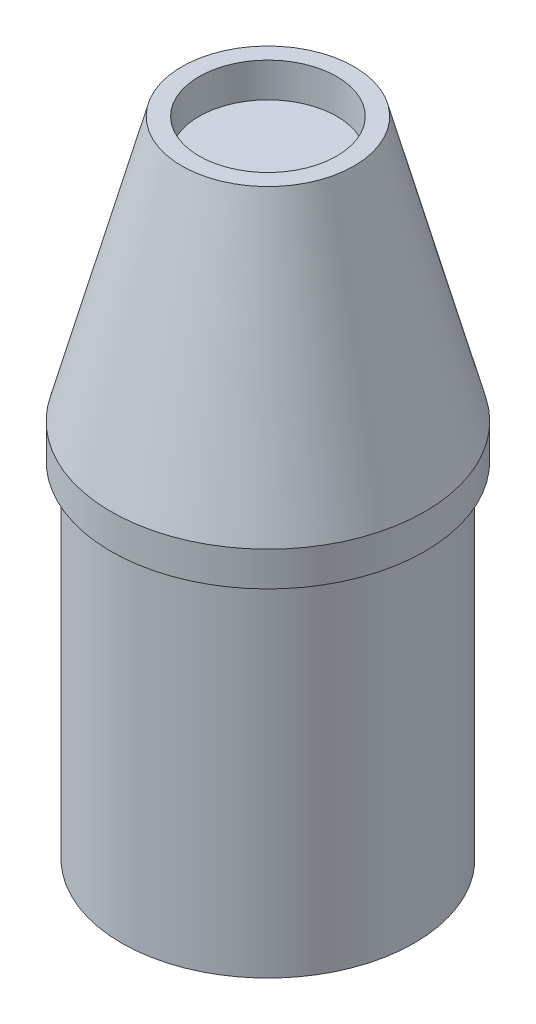
ISO-10303-21;
HEADER;
FILE_DESCRIPTION(('STEP AP214'),'2;1');
FILE_NAME('part.step','',(''),(''),'','','');
FILE_SCHEMA(('AUTOMOTIVE_DESIGN { 1 0 10303 214 1 1 1 1 }'));
ENDSEC;
DATA;
#1=APPLICATION_CONTEXT('core data for automotive mechanical design processes');
#2=APPLICATION_PROTOCOL_DEFINITION('international standard','automotive_design',2000,#1);
#3=PRODUCT_CONTEXT('',#1,'mechanical');
#4=PRODUCT('Part','Part','',(#3));
#5=PRODUCT_RELATED_PRODUCT_CATEGORY('part','',(#4));
#6=PRODUCT_DEFINITION_FORMATION('','',#4);
#7=PRODUCT_DEFINITION_CONTEXT('part definition',#1,'design');
#8=PRODUCT_DEFINITION('design','',#6,#7);
#9=PRODUCT_DEFINITION_SHAPE('','',#8);
#10=(LENGTH_UNIT() NAMED_UNIT(*) SI_UNIT(.MILLI.,.METRE.));
#11=(NAMED_UNIT(*) PLANE_ANGLE_UNIT() SI_UNIT($,.RADIAN.));
#12=(NAMED_UNIT(*) SI_UNIT($,.STERADIAN.) SOLID_ANGLE_UNIT());
#13=UNCERTAINTY_MEASURE_WITH_UNIT(LENGTH_MEASURE(1.E-05),#10,'distance_accuracy_value','');
#14=(GEOMETRIC_REPRESENTATION_CONTEXT(3) GLOBAL_UNCERTAINTY_ASSIGNED_CONTEXT((#13)) GLOBAL_UNIT_ASSIGNED_CONTEXT((#10,
#11,#12)) REPRESENTATION_CONTEXT('',''));
#15=CARTESIAN_POINT('',(0.,0.,0.));
#16=DIRECTION('',(0.,0.,1.));
#17=DIRECTION('',(1.,0.,0.));
#18=AXIS2_PLACEMENT_3D('',#15,#16,#17);
#19=CARTESIAN_POINT('',(26.9875,-4.24972556290004,0.));
#20=DIRECTION('',(0.,-1.,0.));
#21=DIRECTION('',(1.,0.,0.));
#22=AXIS2_PLACEMENT_3D('',#19,#20,#21);
#23=PLANE('',#22);
#24=CARTESIAN_POINT('',(0.,-4.24972556290004,0.));
#25=DIRECTION('',(0.,-1.,0.));
#26=DIRECTION('',(1.,0.,0.));
#27=AXIS2_PLACEMENT_3D('',#24,#25,#26);
#28=CIRCLE('',#27,26.9875);
#29=CARTESIAN_POINT('',(26.9875,-4.24972556290004,0.));
#30=VERTEX_POINT('',#29);
#31=EDGE_CURVE('E62',#30,#30,#28,.T.);
#32=ORIENTED_EDGE('',*,*,#31,.T.);
#33=EDGE_LOOP('',(#32));
#34=FACE_BOUND('',#33,.T.);
#35=ADVANCED_FACE('F37',(#34),#23,.T.);
#36=CARTESIAN_POINT('',(0.,107.927039915141,0.));
#37=DIRECTION('',(0.,1.,0.));
#38=DIRECTION('',(-1.,0.,0.));
#39=AXIS2_PLACEMENT_3D('',#36,#37,#38);
#40=PLANE('',#39);
#41=CARTESIAN_POINT('',(0.,107.927039915141,0.));
#42=DIRECTION('',(0.,-1.,0.));
#43=DIRECTION('',(1.,0.,0.));
#44=AXIS2_PLACEMENT_3D('',#41,#42,#43);
#45=CIRCLE('',#44,12.7);
#46=CARTESIAN_POINT('',(12.7,107.927039915141,0.));
#47=VERTEX_POINT('',#46);
#48=EDGE_CURVE('E10',#47,#47,#45,.T.);
#49=ORIENTED_EDGE('',*,*,#48,.F.);
#50=EDGE_LOOP('',(#49));
#51=FACE_BOUND('',#50,.T.);
#52=ADVANCED_FACE('F79',(#51),#40,.T.);
#53=CARTESIAN_POINT('',(0.,-4.24972556290004,0.));
#54=DIRECTION('',(0.,-1.,0.));
#55=DIRECTION('',(1.,0.,0.));
#56=AXIS2_PLACEMENT_3D('',#53,#54,#55);
#57=CYLINDRICAL_SURFACE('',#56,12.7);
#58=ORIENTED_EDGE('',*,*,#48,.T.);
#59=EDGE_LOOP('',(#58));
#60=FACE_BOUND('',#59,.T.);
#61=CARTESIAN_POINT('',(0.,114.277039915141,0.));
#62=DIRECTION('',(0.,-1.,0.));
#63=DIRECTION('',(1.,0.,0.));
#64=AXIS2_PLACEMENT_3D('',#61,#62,#63);
#65=CIRCLE('',#64,12.7);
#66=CARTESIAN_POINT('',(12.7,114.277039915141,0.));
#67=VERTEX_POINT('',#66);
#68=EDGE_CURVE('E43',#67,#67,#65,.T.);
#69=ORIENTED_EDGE('',*,*,#68,.F.);
#70=EDGE_LOOP('',(#69));
#71=FACE_BOUND('',#70,.T.);
#72=ADVANCED_FACE('F83',(#60,#71),#57,.F.);
#73=CARTESIAN_POINT('',(12.7,114.277039915141,0.));
#74=DIRECTION('',(0.,1.,0.));
#75=DIRECTION('',(-1.,0.,0.));
#76=AXIS2_PLACEMENT_3D('',#73,#74,#75);
#77=PLANE('',#76);
#78=ORIENTED_EDGE('',*,*,#68,.T.);
#79=EDGE_LOOP('',(#78));
#80=FACE_BOUND('',#79,.T.);
#81=CARTESIAN_POINT('',(0.,114.277039915141,0.));
#82=DIRECTION('',(0.,-1.,0.));
#83=DIRECTION('',(1.,0.,0.));
#84=AXIS2_PLACEMENT_3D('',#81,#82,#83);
#85=CIRCLE('',#84,15.875);
#86=CARTESIAN_POINT('',(15.875,114.277039915141,0.));
#87=VERTEX_POINT('',#86);
#88=EDGE_CURVE('E47',#87,#87,#85,.T.);
#89=ORIENTED_EDGE('',*,*,#88,.F.);
#90=EDGE_LOOP('',(#89));
#91=FACE_BOUND('',#90,.T.);
#92=ADVANCED_FACE('F88',(#80,#91),#77,.T.);
#93=CARTESIAN_POINT('',(0.,65.6002744371,0.));
#94=DIRECTION('',(0.,-1.,0.));
#95=DIRECTION('',(1.,0.,0.));
#96=AXIS2_PLACEMENT_3D('',#93,#94,#95);
#97=CONICAL_SURFACE('',#96,28.9179,0.261799387799143);
#98=ORIENTED_EDGE('',*,*,#88,.T.);
#99=EDGE_LOOP('',(#98));
#100=FACE_BOUND('',#99,.T.);
#101=CARTESIAN_POINT('',(0.,65.6002744371,0.));
#102=DIRECTION('',(0.,-1.,0.));
#103=DIRECTION('',(1.,0.,0.));
#104=AXIS2_PLACEMENT_3D('',#101,#102,#103);
#105=CIRCLE('',#104,28.9179);
#106=CARTESIAN_POINT('',(28.9179,65.6002744371,0.));
#107=VERTEX_POINT('',#106);
#108=EDGE_CURVE('E51',#107,#107,#105,.T.);
#109=ORIENTED_EDGE('',*,*,#108,.F.);
#110=EDGE_LOOP('',(#109));
#111=FACE_BOUND('',#110,.T.);
#112=ADVANCED_FACE('F93',(#100,#111),#97,.T.);
#113=CARTESIAN_POINT('',(0.,-4.24972556290004,0.));
#114=DIRECTION('',(0.,-1.,0.));
#115=DIRECTION('',(1.,0.,0.));
#116=AXIS2_PLACEMENT_3D('',#113,#114,#115);
#117=CYLINDRICAL_SURFACE('',#116,28.9179);
#118=ORIENTED_EDGE('',*,*,#108,.T.);
#119=EDGE_LOOP('',(#118));
#120=FACE_BOUND('',#119,.T.);
#121=CARTESIAN_POINT('',(0.,59.2502744371,0.));
#122=DIRECTION('',(0.,-1.,0.));
#123=DIRECTION('',(1.,0.,0.));
#124=AXIS2_PLACEMENT_3D('',#121,#122,#123);
#125=CIRCLE('',#124,28.9179);
#126=CARTESIAN_POINT('',(28.9179,59.2502744371,0.));
#127=VERTEX_POINT('',#126);
#128=EDGE_CURVE('E56',#127,#127,#125,.T.);
#129=ORIENTED_EDGE('',*,*,#128,.F.);
#130=EDGE_LOOP('',(#129));
#131=FACE_BOUND('',#130,.T.);
#132=ADVANCED_FACE('F75',(#120,#131),#117,.T.);
#133=CARTESIAN_POINT('',(28.9179,59.2502744371,0.));
#134=DIRECTION('',(0.,-1.,0.));
#135=DIRECTION('',(1.,0.,0.));
#136=AXIS2_PLACEMENT_3D('',#133,#134,#135);
#137=PLANE('',#136);
#138=ORIENTED_EDGE('',*,*,#128,.T.);
#139=EDGE_LOOP('',(#138));
#140=FACE_BOUND('',#139,.T.);
#141=CARTESIAN_POINT('',(0.,59.2502744371,0.));
#142=DIRECTION('',(0.,-1.,0.));
#143=DIRECTION('',(1.,0.,0.));
#144=AXIS2_PLACEMENT_3D('',#141,#142,#143);
#145=CIRCLE('',#144,26.9875);
#146=CARTESIAN_POINT('',(26.9875,59.2502744371,0.));
#147=VERTEX_POINT('',#146);
#148=EDGE_CURVE('E59',#147,#147,#145,.T.);
#149=ORIENTED_EDGE('',*,*,#148,.F.);
#150=EDGE_LOOP('',(#149));
#151=FACE_BOUND('',#150,.T.);
#152=ADVANCED_FACE('F69',(#140,#151),#137,.T.);
#153=CARTESIAN_POINT('',(0.,-4.24972556290004,0.));
#154=DIRECTION('',(0.,-1.,0.));
#155=DIRECTION('',(1.,0.,0.));
#156=AXIS2_PLACEMENT_3D('',#153,#154,#155);
#157=CYLINDRICAL_SURFACE('',#156,26.9875);
#158=ORIENTED_EDGE('',*,*,#148,.T.);
#159=EDGE_LOOP('',(#158));
#160=FACE_BOUND('',#159,.T.);
#161=ORIENTED_EDGE('',*,*,#31,.F.);
#162=EDGE_LOOP('',(#161));
#163=FACE_BOUND('',#162,.T.);
#164=ADVANCED_FACE('F67',(#160,#163),#157,.T.);
#165=CLOSED_SHELL('',(#35,#52,#72,#92,#112,#132,#152,#164));
#166=MANIFOLD_SOLID_BREP('B2',#165);
#167=ADVANCED_BREP_SHAPE_REPRESENTATION('',(#18,#166),#14);
#168=SHAPE_DEFINITION_REPRESENTATION(#9,#167);
ENDSEC;
END-ISO-10303-21;
